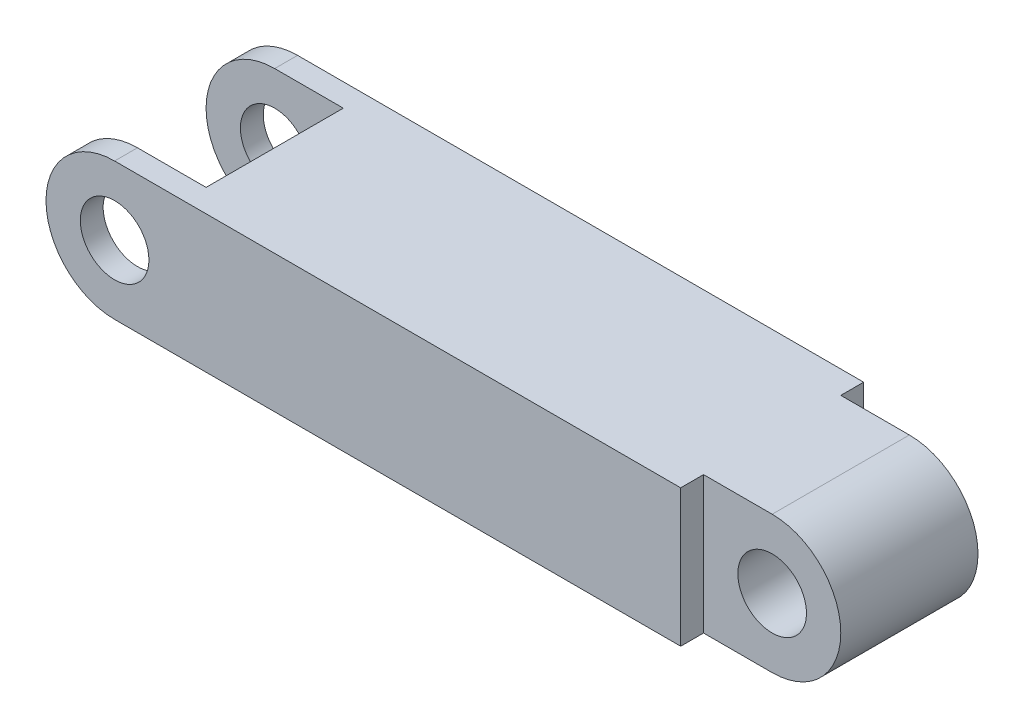
ISO-10303-21;
HEADER;
FILE_DESCRIPTION(('STEP AP214'),'2;1');
FILE_NAME('part.step','',(''),(''),'','','');
FILE_SCHEMA(('AUTOMOTIVE_DESIGN { 1 0 10303 214 1 1 1 1 }'));
ENDSEC;
DATA;
#1=APPLICATION_CONTEXT('core data for automotive mechanical design processes');
#2=APPLICATION_PROTOCOL_DEFINITION('international standard','automotive_design',2000,#1);
#3=PRODUCT_CONTEXT('',#1,'mechanical');
#4=PRODUCT('Part','Part','',(#3));
#5=PRODUCT_RELATED_PRODUCT_CATEGORY('part','',(#4));
#6=PRODUCT_DEFINITION_FORMATION('','',#4);
#7=PRODUCT_DEFINITION_CONTEXT('part definition',#1,'design');
#8=PRODUCT_DEFINITION('design','',#6,#7);
#9=PRODUCT_DEFINITION_SHAPE('','',#8);
#10=(LENGTH_UNIT() NAMED_UNIT(*) SI_UNIT(.MILLI.,.METRE.));
#11=(NAMED_UNIT(*) PLANE_ANGLE_UNIT() SI_UNIT($,.RADIAN.));
#12=(NAMED_UNIT(*) SI_UNIT($,.STERADIAN.) SOLID_ANGLE_UNIT());
#13=UNCERTAINTY_MEASURE_WITH_UNIT(LENGTH_MEASURE(1.E-05),#10,'distance_accuracy_value','');
#14=(GEOMETRIC_REPRESENTATION_CONTEXT(3) GLOBAL_UNCERTAINTY_ASSIGNED_CONTEXT((#13)) GLOBAL_UNIT_ASSIGNED_CONTEXT((#10,
#11,#12)) REPRESENTATION_CONTEXT('',''));
#15=CARTESIAN_POINT('',(0.,0.,0.));
#16=DIRECTION('',(0.,0.,1.));
#17=DIRECTION('',(1.,0.,0.));
#18=AXIS2_PLACEMENT_3D('',#15,#16,#17);
#19=CARTESIAN_POINT('',(0.,0.,40.));
#20=DIRECTION('',(0.,0.,-1.));
#21=DIRECTION('',(-1.,0.,0.));
#22=AXIS2_PLACEMENT_3D('',#19,#20,#21);
#23=CYLINDRICAL_SURFACE('',#22,15.);
#24=DIRECTION('',(0.,0.,-1.));
#25=VECTOR('',#24,1.);
#26=CARTESIAN_POINT('',(0.,15.,40.));
#27=LINE('',#26,#25);
#28=CARTESIAN_POINT('',(0.,15.,40.));
#29=VERTEX_POINT('',#28);
#30=CARTESIAN_POINT('',(0.,15.,35.));
#31=VERTEX_POINT('',#30);
#32=EDGE_CURVE('E218',#29,#31,#27,.T.);
#33=ORIENTED_EDGE('',*,*,#32,.T.);
#34=CARTESIAN_POINT('',(0.,0.,35.));
#35=DIRECTION('',(0.,0.,1.));
#36=DIRECTION('',(1.,0.,0.));
#37=AXIS2_PLACEMENT_3D('',#34,#35,#36);
#38=CIRCLE('',#37,15.);
#39=CARTESIAN_POINT('',(0.,-15.,35.));
#40=VERTEX_POINT('',#39);
#41=EDGE_CURVE('E192',#31,#40,#38,.T.);
#42=ORIENTED_EDGE('',*,*,#41,.T.);
#43=DIRECTION('',(0.,0.,-1.));
#44=VECTOR('',#43,1.);
#45=CARTESIAN_POINT('',(0.,-15.,40.));
#46=LINE('',#45,#44);
#47=CARTESIAN_POINT('',(0.,-15.,40.));
#48=VERTEX_POINT('',#47);
#49=EDGE_CURVE('E11',#48,#40,#46,.T.);
#50=ORIENTED_EDGE('',*,*,#49,.F.);
#51=CARTESIAN_POINT('',(0.,0.,40.));
#52=DIRECTION('',(0.,0.,1.));
#53=DIRECTION('',(1.,0.,0.));
#54=AXIS2_PLACEMENT_3D('',#51,#52,#53);
#55=CIRCLE('',#54,15.);
#56=EDGE_CURVE('E201',#29,#48,#55,.T.);
#57=ORIENTED_EDGE('',*,*,#56,.F.);
#58=EDGE_LOOP('',(#33,#42,#50,#57));
#59=FACE_BOUND('',#58,.T.);
#60=ADVANCED_FACE('F33',(#59),#23,.T.);
#61=CARTESIAN_POINT('',(0.,0.,40.));
#62=DIRECTION('',(0.,0.,-1.));
#63=DIRECTION('',(-1.,0.,0.));
#64=AXIS2_PLACEMENT_3D('',#61,#62,#63);
#65=CYLINDRICAL_SURFACE('',#64,7.5);
#66=CARTESIAN_POINT('',(0.,0.,35.));
#67=DIRECTION('',(0.,0.,1.));
#68=DIRECTION('',(1.,0.,0.));
#69=AXIS2_PLACEMENT_3D('',#66,#67,#68);
#70=CIRCLE('',#69,7.5);
#71=CARTESIAN_POINT('',(7.5,0.,35.));
#72=VERTEX_POINT('',#71);
#73=EDGE_CURVE('E37',#72,#72,#70,.T.);
#74=ORIENTED_EDGE('',*,*,#73,.F.);
#75=EDGE_LOOP('',(#74));
#76=FACE_BOUND('',#75,.T.);
#77=CARTESIAN_POINT('',(0.,0.,40.));
#78=DIRECTION('',(0.,0.,1.));
#79=DIRECTION('',(1.,0.,0.));
#80=AXIS2_PLACEMENT_3D('',#77,#78,#79);
#81=CIRCLE('',#80,7.5);
#82=CARTESIAN_POINT('',(7.5,0.,40.));
#83=VERTEX_POINT('',#82);
#84=EDGE_CURVE('E195',#83,#83,#81,.T.);
#85=ORIENTED_EDGE('',*,*,#84,.T.);
#86=EDGE_LOOP('',(#85));
#87=FACE_BOUND('',#86,.T.);
#88=ADVANCED_FACE('F240',(#76,#87),#65,.F.);
#89=CARTESIAN_POINT('',(0.,0.,40.));
#90=DIRECTION('',(0.,0.,1.));
#91=DIRECTION('',(1.,0.,0.));
#92=AXIS2_PLACEMENT_3D('',#89,#90,#91);
#93=PLANE('',#92);
#94=DIRECTION('',(0.,1.,0.));
#95=VECTOR('',#94,1.);
#96=CARTESIAN_POINT('',(123.76149627818,-15.,40.));
#97=LINE('',#96,#95);
#98=CARTESIAN_POINT('',(123.76149627818,-15.,40.));
#99=VERTEX_POINT('',#98);
#100=CARTESIAN_POINT('',(123.76149627818,15.,40.));
#101=VERTEX_POINT('',#100);
#102=EDGE_CURVE('E151',#99,#101,#97,.T.);
#103=ORIENTED_EDGE('',*,*,#102,.T.);
#104=DIRECTION('',(-1.,0.,0.));
#105=VECTOR('',#104,1.);
#106=CARTESIAN_POINT('',(0.,15.,40.));
#107=LINE('',#106,#105);
#108=EDGE_CURVE('E208',#101,#29,#107,.T.);
#109=ORIENTED_EDGE('',*,*,#108,.T.);
#110=ORIENTED_EDGE('',*,*,#56,.T.);
#111=DIRECTION('',(1.,0.,0.));
#112=VECTOR('',#111,1.);
#113=CARTESIAN_POINT('',(0.,-15.,40.));
#114=LINE('',#113,#112);
#115=EDGE_CURVE('E204',#48,#99,#114,.T.);
#116=ORIENTED_EDGE('',*,*,#115,.T.);
#117=EDGE_LOOP('',(#103,#109,#110,#116));
#118=FACE_BOUND('',#117,.T.);
#119=ORIENTED_EDGE('',*,*,#84,.F.);
#120=EDGE_LOOP('',(#119));
#121=FACE_BOUND('',#120,.T.);
#122=ADVANCED_FACE('F245',(#118,#121),#93,.T.);
#123=CARTESIAN_POINT('',(0.,0.,0.));
#124=DIRECTION('',(0.,0.,1.));
#125=DIRECTION('',(1.,0.,0.));
#126=AXIS2_PLACEMENT_3D('',#123,#124,#125);
#127=PLANE('',#126);
#128=DIRECTION('',(-1.,0.,0.));
#129=VECTOR('',#128,1.);
#130=CARTESIAN_POINT('',(0.,15.,0.));
#131=LINE('',#130,#129);
#132=CARTESIAN_POINT('',(123.76149627818,15.,0.));
#133=VERTEX_POINT('',#132);
#134=CARTESIAN_POINT('',(0.,15.,0.));
#135=VERTEX_POINT('',#134);
#136=EDGE_CURVE('E205',#133,#135,#131,.T.);
#137=ORIENTED_EDGE('',*,*,#136,.F.);
#138=DIRECTION('',(0.,1.,0.));
#139=VECTOR('',#138,1.);
#140=CARTESIAN_POINT('',(123.76149627818,-15.,0.));
#141=LINE('',#140,#139);
#142=CARTESIAN_POINT('',(123.76149627818,-15.,0.));
#143=VERTEX_POINT('',#142);
#144=EDGE_CURVE('E178',#143,#133,#141,.T.);
#145=ORIENTED_EDGE('',*,*,#144,.F.);
#146=DIRECTION('',(1.,0.,0.));
#147=VECTOR('',#146,1.);
#148=CARTESIAN_POINT('',(0.,-15.,0.));
#149=LINE('',#148,#147);
#150=CARTESIAN_POINT('',(0.,-15.,0.));
#151=VERTEX_POINT('',#150);
#152=EDGE_CURVE('E213',#151,#143,#149,.T.);
#153=ORIENTED_EDGE('',*,*,#152,.F.);
#154=CARTESIAN_POINT('',(0.,0.,0.));
#155=DIRECTION('',(0.,0.,1.));
#156=DIRECTION('',(1.,0.,0.));
#157=AXIS2_PLACEMENT_3D('',#154,#155,#156);
#158=CIRCLE('',#157,15.);
#159=EDGE_CURVE('E198',#135,#151,#158,.T.);
#160=ORIENTED_EDGE('',*,*,#159,.F.);
#161=EDGE_LOOP('',(#137,#145,#153,#160));
#162=FACE_BOUND('',#161,.T.);
#163=CARTESIAN_POINT('',(0.,0.,0.));
#164=DIRECTION('',(0.,0.,1.));
#165=DIRECTION('',(1.,0.,0.));
#166=AXIS2_PLACEMENT_3D('',#163,#164,#165);
#167=CIRCLE('',#166,7.5);
#168=CARTESIAN_POINT('',(7.5,0.,0.));
#169=VERTEX_POINT('',#168);
#170=EDGE_CURVE('E194',#169,#169,#167,.T.);
#171=ORIENTED_EDGE('',*,*,#170,.T.);
#172=EDGE_LOOP('',(#171));
#173=FACE_BOUND('',#172,.T.);
#174=ADVANCED_FACE('F243',(#162,#173),#127,.F.);
#175=CARTESIAN_POINT('',(0.,0.,5.));
#176=DIRECTION('',(0.,0.,-1.));
#177=DIRECTION('',(-1.,0.,0.));
#178=AXIS2_PLACEMENT_3D('',#175,#176,#177);
#179=CIRCLE('',#178,15.);
#180=CARTESIAN_POINT('',(0.,-15.,5.));
#181=VERTEX_POINT('',#180);
#182=CARTESIAN_POINT('',(0.,15.,5.));
#183=VERTEX_POINT('',#182);
#184=EDGE_CURVE('E138',#181,#183,#179,.T.);
#185=ORIENTED_EDGE('',*,*,#184,.T.);
#186=EDGE_CURVE('E210',#183,#135,#27,.T.);
#187=ORIENTED_EDGE('',*,*,#186,.T.);
#188=ORIENTED_EDGE('',*,*,#159,.T.);
#189=EDGE_CURVE('E42',#181,#151,#46,.T.);
#190=ORIENTED_EDGE('',*,*,#189,.F.);
#191=EDGE_LOOP('',(#185,#187,#188,#190));
#192=FACE_BOUND('',#191,.T.);
#193=ADVANCED_FACE('F35',(#192),#23,.T.);
#194=CARTESIAN_POINT('',(0.,-15.,40.));
#195=DIRECTION('',(0.,1.,0.));
#196=DIRECTION('',(0.,0.,1.));
#197=AXIS2_PLACEMENT_3D('',#194,#195,#196);
#198=PLANE('',#197);
#199=ORIENTED_EDGE('',*,*,#49,.T.);
#200=DIRECTION('',(1.,0.,0.));
#201=VECTOR('',#200,1.);
#202=CARTESIAN_POINT('',(15.,-15.,35.));
#203=LINE('',#202,#201);
#204=CARTESIAN_POINT('',(15.,-15.,35.));
#205=VERTEX_POINT('',#204);
#206=EDGE_CURVE('E133',#40,#205,#203,.T.);
#207=ORIENTED_EDGE('',*,*,#206,.T.);
#208=DIRECTION('',(0.,0.,-1.));
#209=VECTOR('',#208,1.);
#210=CARTESIAN_POINT('',(15.,-15.,5.));
#211=LINE('',#210,#209);
#212=CARTESIAN_POINT('',(15.,-15.,5.));
#213=VERTEX_POINT('',#212);
#214=EDGE_CURVE('E127',#205,#213,#211,.T.);
#215=ORIENTED_EDGE('',*,*,#214,.T.);
#216=DIRECTION('',(-1.,0.,0.));
#217=VECTOR('',#216,1.);
#218=CARTESIAN_POINT('',(15.,-15.,5.));
#219=LINE('',#218,#217);
#220=EDGE_CURVE('E136',#213,#181,#219,.T.);
#221=ORIENTED_EDGE('',*,*,#220,.T.);
#222=ORIENTED_EDGE('',*,*,#189,.T.);
#223=ORIENTED_EDGE('',*,*,#152,.T.);
#224=DIRECTION('',(0.,0.,1.));
#225=VECTOR('',#224,1.);
#226=CARTESIAN_POINT('',(123.76149627818,-15.,0.));
#227=LINE('',#226,#225);
#228=CARTESIAN_POINT('',(123.76149627818,-15.,5.));
#229=VERTEX_POINT('',#228);
#230=EDGE_CURVE('E171',#143,#229,#227,.T.);
#231=ORIENTED_EDGE('',*,*,#230,.T.);
#232=DIRECTION('',(1.,0.,0.));
#233=VECTOR('',#232,1.);
#234=CARTESIAN_POINT('',(153.76149627818,-15.,5.00000000000002));
#235=LINE('',#234,#233);
#236=CARTESIAN_POINT('',(138.76149627818,-15.,5.00000000000001));
#237=VERTEX_POINT('',#236);
#238=EDGE_CURVE('E174',#229,#237,#235,.T.);
#239=ORIENTED_EDGE('',*,*,#238,.T.);
#240=DIRECTION('',(0.,0.,-1.));
#241=VECTOR('',#240,1.);
#242=CARTESIAN_POINT('',(138.76149627818,-15.,40.));
#243=LINE('',#242,#241);
#244=CARTESIAN_POINT('',(138.76149627818,-15.,35.));
#245=VERTEX_POINT('',#244);
#246=EDGE_CURVE('E224',#245,#237,#243,.T.);
#247=ORIENTED_EDGE('',*,*,#246,.F.);
#248=DIRECTION('',(-1.,0.,0.));
#249=VECTOR('',#248,1.);
#250=CARTESIAN_POINT('',(153.76149627818,-15.,35.));
#251=LINE('',#250,#249);
#252=CARTESIAN_POINT('',(123.76149627818,-15.,35.));
#253=VERTEX_POINT('',#252);
#254=EDGE_CURVE('E155',#245,#253,#251,.T.);
#255=ORIENTED_EDGE('',*,*,#254,.T.);
#256=DIRECTION('',(0.,0.,1.));
#257=VECTOR('',#256,1.);
#258=CARTESIAN_POINT('',(123.76149627818,-15.,40.));
#259=LINE('',#258,#257);
#260=EDGE_CURVE('E158',#253,#99,#259,.T.);
#261=ORIENTED_EDGE('',*,*,#260,.T.);
#262=ORIENTED_EDGE('',*,*,#115,.F.);
#263=EDGE_LOOP('',(#199,#207,#215,#221,#222,#223,#231,#239,#247,#255,#261,#262));
#264=FACE_BOUND('',#263,.T.);
#265=ADVANCED_FACE('F142',(#264),#198,.F.);
#266=CARTESIAN_POINT('',(138.76149627818,0.,40.));
#267=DIRECTION('',(0.,0.,-1.));
#268=DIRECTION('',(-1.,0.,0.));
#269=AXIS2_PLACEMENT_3D('',#266,#267,#268);
#270=CYLINDRICAL_SURFACE('',#269,15.);
#271=DIRECTION('',(0.,0.,-1.));
#272=VECTOR('',#271,1.);
#273=CARTESIAN_POINT('',(138.76149627818,15.,40.));
#274=LINE('',#273,#272);
#275=CARTESIAN_POINT('',(138.76149627818,15.,35.));
#276=VERTEX_POINT('',#275);
#277=CARTESIAN_POINT('',(138.76149627818,15.,5.00000000000001));
#278=VERTEX_POINT('',#277);
#279=EDGE_CURVE('E221',#276,#278,#274,.T.);
#280=ORIENTED_EDGE('',*,*,#279,.F.);
#281=CARTESIAN_POINT('',(138.76149627818,0.,35.));
#282=DIRECTION('',(0.,0.,-1.));
#283=DIRECTION('',(-1.,0.,0.));
#284=AXIS2_PLACEMENT_3D('',#281,#282,#283);
#285=CIRCLE('',#284,15.);
#286=EDGE_CURVE('E58',#276,#245,#285,.T.);
#287=ORIENTED_EDGE('',*,*,#286,.T.);
#288=ORIENTED_EDGE('',*,*,#246,.T.);
#289=CARTESIAN_POINT('',(138.76149627818,0.,5.00000000000001));
#290=DIRECTION('',(0.,0.,1.));
#291=DIRECTION('',(1.,0.,0.));
#292=AXIS2_PLACEMENT_3D('',#289,#290,#291);
#293=CIRCLE('',#292,15.);
#294=EDGE_CURVE('E186',#237,#278,#293,.T.);
#295=ORIENTED_EDGE('',*,*,#294,.T.);
#296=EDGE_LOOP('',(#280,#287,#288,#295));
#297=FACE_BOUND('',#296,.T.);
#298=ADVANCED_FACE('F279',(#297),#270,.T.);
#299=CARTESIAN_POINT('',(0.,15.,40.));
#300=DIRECTION('',(0.,-1.,0.));
#301=DIRECTION('',(0.,0.,-1.));
#302=AXIS2_PLACEMENT_3D('',#299,#300,#301);
#303=PLANE('',#302);
#304=DIRECTION('',(0.,0.,-1.));
#305=VECTOR('',#304,1.);
#306=CARTESIAN_POINT('',(15.,15.,5.));
#307=LINE('',#306,#305);
#308=CARTESIAN_POINT('',(15.,15.,35.));
#309=VERTEX_POINT('',#308);
#310=CARTESIAN_POINT('',(15.,15.,5.));
#311=VERTEX_POINT('',#310);
#312=EDGE_CURVE('E50',#309,#311,#307,.T.);
#313=ORIENTED_EDGE('',*,*,#312,.F.);
#314=DIRECTION('',(1.,0.,0.));
#315=VECTOR('',#314,1.);
#316=CARTESIAN_POINT('',(15.,15.,35.));
#317=LINE('',#316,#315);
#318=EDGE_CURVE('E144',#31,#309,#317,.T.);
#319=ORIENTED_EDGE('',*,*,#318,.F.);
#320=ORIENTED_EDGE('',*,*,#32,.F.);
#321=ORIENTED_EDGE('',*,*,#108,.F.);
#322=DIRECTION('',(0.,0.,1.));
#323=VECTOR('',#322,1.);
#324=CARTESIAN_POINT('',(123.76149627818,15.,40.));
#325=LINE('',#324,#323);
#326=CARTESIAN_POINT('',(123.76149627818,15.,35.));
#327=VERTEX_POINT('',#326);
#328=EDGE_CURVE('E159',#327,#101,#325,.T.);
#329=ORIENTED_EDGE('',*,*,#328,.F.);
#330=DIRECTION('',(-1.,0.,0.));
#331=VECTOR('',#330,1.);
#332=CARTESIAN_POINT('',(153.76149627818,15.,35.));
#333=LINE('',#332,#331);
#334=EDGE_CURVE('E163',#276,#327,#333,.T.);
#335=ORIENTED_EDGE('',*,*,#334,.F.);
#336=ORIENTED_EDGE('',*,*,#279,.T.);
#337=DIRECTION('',(1.,0.,0.));
#338=VECTOR('',#337,1.);
#339=CARTESIAN_POINT('',(153.76149627818,15.,5.00000000000002));
#340=LINE('',#339,#338);
#341=CARTESIAN_POINT('',(123.76149627818,15.,5.));
#342=VERTEX_POINT('',#341);
#343=EDGE_CURVE('E175',#342,#278,#340,.T.);
#344=ORIENTED_EDGE('',*,*,#343,.F.);
#345=DIRECTION('',(0.,0.,1.));
#346=VECTOR('',#345,1.);
#347=CARTESIAN_POINT('',(123.76149627818,15.,0.));
#348=LINE('',#347,#346);
#349=EDGE_CURVE('E179',#133,#342,#348,.T.);
#350=ORIENTED_EDGE('',*,*,#349,.F.);
#351=ORIENTED_EDGE('',*,*,#136,.T.);
#352=ORIENTED_EDGE('',*,*,#186,.F.);
#353=DIRECTION('',(-1.,0.,0.));
#354=VECTOR('',#353,1.);
#355=CARTESIAN_POINT('',(15.,15.,5.));
#356=LINE('',#355,#354);
#357=EDGE_CURVE('E146',#311,#183,#356,.T.);
#358=ORIENTED_EDGE('',*,*,#357,.F.);
#359=EDGE_LOOP('',(#313,#319,#320,#321,#329,#335,#336,#344,#350,#351,#352,#358));
#360=FACE_BOUND('',#359,.T.);
#361=ADVANCED_FACE('F238',(#360),#303,.F.);
#362=CARTESIAN_POINT('',(0.,0.,5.));
#363=DIRECTION('',(0.,0.,-1.));
#364=DIRECTION('',(-1.,0.,0.));
#365=AXIS2_PLACEMENT_3D('',#362,#363,#364);
#366=CIRCLE('',#365,7.5);
#367=CARTESIAN_POINT('',(-7.5,0.,5.));
#368=VERTEX_POINT('',#367);
#369=EDGE_CURVE('E190',#368,#368,#366,.T.);
#370=ORIENTED_EDGE('',*,*,#369,.F.);
#371=EDGE_LOOP('',(#370));
#372=FACE_BOUND('',#371,.T.);
#373=ORIENTED_EDGE('',*,*,#170,.F.);
#374=EDGE_LOOP('',(#373));
#375=FACE_BOUND('',#374,.T.);
#376=ADVANCED_FACE('F234',(#372,#375),#65,.F.);
#377=CARTESIAN_POINT('',(153.76149627818,-15.,5.00000000000002));
#378=DIRECTION('',(0.,0.,1.));
#379=DIRECTION('',(1.,0.,0.));
#380=AXIS2_PLACEMENT_3D('',#377,#378,#379);
#381=PLANE('',#380);
#382=CARTESIAN_POINT('',(138.76149627818,0.,5.00000000000001));
#383=DIRECTION('',(0.,0.,1.));
#384=DIRECTION('',(1.,0.,0.));
#385=AXIS2_PLACEMENT_3D('',#382,#383,#384);
#386=CIRCLE('',#385,7.50000000000001);
#387=CARTESIAN_POINT('',(146.26149627818,0.,5.00000000000002));
#388=VERTEX_POINT('',#387);
#389=EDGE_CURVE('E153',#388,#388,#386,.T.);
#390=ORIENTED_EDGE('',*,*,#389,.T.);
#391=EDGE_LOOP('',(#390));
#392=FACE_BOUND('',#391,.T.);
#393=ORIENTED_EDGE('',*,*,#294,.F.);
#394=ORIENTED_EDGE('',*,*,#238,.F.);
#395=DIRECTION('',(0.,1.,0.));
#396=VECTOR('',#395,1.);
#397=CARTESIAN_POINT('',(123.76149627818,-15.,5.));
#398=LINE('',#397,#396);
#399=EDGE_CURVE('E165',#229,#342,#398,.T.);
#400=ORIENTED_EDGE('',*,*,#399,.T.);
#401=ORIENTED_EDGE('',*,*,#343,.T.);
#402=EDGE_LOOP('',(#393,#394,#400,#401));
#403=FACE_BOUND('',#402,.T.);
#404=ADVANCED_FACE('F237',(#392,#403),#381,.F.);
#405=CARTESIAN_POINT('',(123.76149627818,-15.,0.));
#406=DIRECTION('',(-1.,0.,0.));
#407=DIRECTION('',(0.,0.,1.));
#408=AXIS2_PLACEMENT_3D('',#405,#406,#407);
#409=PLANE('',#408);
#410=ORIENTED_EDGE('',*,*,#349,.T.);
#411=ORIENTED_EDGE('',*,*,#399,.F.);
#412=ORIENTED_EDGE('',*,*,#230,.F.);
#413=ORIENTED_EDGE('',*,*,#144,.T.);
#414=EDGE_LOOP('',(#410,#411,#412,#413));
#415=FACE_BOUND('',#414,.T.);
#416=ADVANCED_FACE('F289',(#415),#409,.F.);
#417=CARTESIAN_POINT('',(153.76149627818,-15.,35.));
#418=DIRECTION('',(0.,0.,-1.));
#419=DIRECTION('',(-1.,0.,0.));
#420=AXIS2_PLACEMENT_3D('',#417,#418,#419);
#421=PLANE('',#420);
#422=CARTESIAN_POINT('',(138.76149627818,0.,35.));
#423=DIRECTION('',(0.,0.,-1.));
#424=DIRECTION('',(-1.,0.,0.));
#425=AXIS2_PLACEMENT_3D('',#422,#423,#424);
#426=CIRCLE('',#425,7.50000000000001);
#427=CARTESIAN_POINT('',(131.26149627818,0.,35.));
#428=VERTEX_POINT('',#427);
#429=EDGE_CURVE('E188',#428,#428,#426,.T.);
#430=ORIENTED_EDGE('',*,*,#429,.T.);
#431=EDGE_LOOP('',(#430));
#432=FACE_BOUND('',#431,.T.);
#433=ORIENTED_EDGE('',*,*,#334,.T.);
#434=DIRECTION('',(0.,1.,0.));
#435=VECTOR('',#434,1.);
#436=CARTESIAN_POINT('',(123.76149627818,-15.,35.));
#437=LINE('',#436,#435);
#438=EDGE_CURVE('E162',#253,#327,#437,.T.);
#439=ORIENTED_EDGE('',*,*,#438,.F.);
#440=ORIENTED_EDGE('',*,*,#254,.F.);
#441=ORIENTED_EDGE('',*,*,#286,.F.);
#442=EDGE_LOOP('',(#433,#439,#440,#441));
#443=FACE_BOUND('',#442,.T.);
#444=ADVANCED_FACE('F291',(#432,#443),#421,.F.);
#445=CARTESIAN_POINT('',(123.76149627818,-15.,40.));
#446=DIRECTION('',(-1.,0.,0.));
#447=DIRECTION('',(0.,0.,1.));
#448=AXIS2_PLACEMENT_3D('',#445,#446,#447);
#449=PLANE('',#448);
#450=ORIENTED_EDGE('',*,*,#328,.T.);
#451=ORIENTED_EDGE('',*,*,#102,.F.);
#452=ORIENTED_EDGE('',*,*,#260,.F.);
#453=ORIENTED_EDGE('',*,*,#438,.T.);
#454=EDGE_LOOP('',(#450,#451,#452,#453));
#455=FACE_BOUND('',#454,.T.);
#456=ADVANCED_FACE('F275',(#455),#449,.F.);
#457=CARTESIAN_POINT('',(15.,-15.,35.));
#458=DIRECTION('',(0.,0.,1.));
#459=DIRECTION('',(1.,0.,0.));
#460=AXIS2_PLACEMENT_3D('',#457,#458,#459);
#461=PLANE('',#460);
#462=ORIENTED_EDGE('',*,*,#73,.T.);
#463=EDGE_LOOP('',(#462));
#464=FACE_BOUND('',#463,.T.);
#465=ORIENTED_EDGE('',*,*,#318,.T.);
#466=DIRECTION('',(0.,1.,0.));
#467=VECTOR('',#466,1.);
#468=CARTESIAN_POINT('',(15.,-15.,35.));
#469=LINE('',#468,#467);
#470=EDGE_CURVE('E132',#205,#309,#469,.T.);
#471=ORIENTED_EDGE('',*,*,#470,.F.);
#472=ORIENTED_EDGE('',*,*,#206,.F.);
#473=ORIENTED_EDGE('',*,*,#41,.F.);
#474=EDGE_LOOP('',(#465,#471,#472,#473));
#475=FACE_BOUND('',#474,.T.);
#476=ADVANCED_FACE('F271',(#464,#475),#461,.F.);
#477=CARTESIAN_POINT('',(15.,-15.,5.));
#478=DIRECTION('',(0.,0.,-1.));
#479=DIRECTION('',(-1.,0.,0.));
#480=AXIS2_PLACEMENT_3D('',#477,#478,#479);
#481=PLANE('',#480);
#482=ORIENTED_EDGE('',*,*,#369,.T.);
#483=EDGE_LOOP('',(#482));
#484=FACE_BOUND('',#483,.T.);
#485=ORIENTED_EDGE('',*,*,#184,.F.);
#486=ORIENTED_EDGE('',*,*,#220,.F.);
#487=DIRECTION('',(0.,1.,0.));
#488=VECTOR('',#487,1.);
#489=CARTESIAN_POINT('',(15.,-15.,5.));
#490=LINE('',#489,#488);
#491=EDGE_CURVE('E123',#213,#311,#490,.T.);
#492=ORIENTED_EDGE('',*,*,#491,.T.);
#493=ORIENTED_EDGE('',*,*,#357,.T.);
#494=EDGE_LOOP('',(#485,#486,#492,#493));
#495=FACE_BOUND('',#494,.T.);
#496=ADVANCED_FACE('F137',(#484,#495),#481,.F.);
#497=CARTESIAN_POINT('',(15.,-15.,5.));
#498=DIRECTION('',(1.,0.,0.));
#499=DIRECTION('',(0.,0.,-1.));
#500=AXIS2_PLACEMENT_3D('',#497,#498,#499);
#501=PLANE('',#500);
#502=ORIENTED_EDGE('',*,*,#312,.T.);
#503=ORIENTED_EDGE('',*,*,#491,.F.);
#504=ORIENTED_EDGE('',*,*,#214,.F.);
#505=ORIENTED_EDGE('',*,*,#470,.T.);
#506=EDGE_LOOP('',(#502,#503,#504,#505));
#507=FACE_BOUND('',#506,.T.);
#508=ADVANCED_FACE('F125',(#507),#501,.F.);
#509=CARTESIAN_POINT('',(138.76149627818,0.,40.));
#510=DIRECTION('',(0.,0.,-1.));
#511=DIRECTION('',(-1.,0.,0.));
#512=AXIS2_PLACEMENT_3D('',#509,#510,#511);
#513=CYLINDRICAL_SURFACE('',#512,7.50000000000001);
#514=ORIENTED_EDGE('',*,*,#429,.F.);
#515=EDGE_LOOP('',(#514));
#516=FACE_BOUND('',#515,.T.);
#517=ORIENTED_EDGE('',*,*,#389,.F.);
#518=EDGE_LOOP('',(#517));
#519=FACE_BOUND('',#518,.T.);
#520=ADVANCED_FACE('F302',(#516,#519),#513,.F.);
#521=CLOSED_SHELL('',(#60,#88,#122,#174,#193,#265,#298,#361,#376,#404,#416,#444,#456,#476,#496,
#508,#520));
#522=MANIFOLD_SOLID_BREP('B2',#521);
#523=ADVANCED_BREP_SHAPE_REPRESENTATION('',(#18,#522),#14);
#524=SHAPE_DEFINITION_REPRESENTATION(#9,#523);
ENDSEC;
END-ISO-10303-21;
